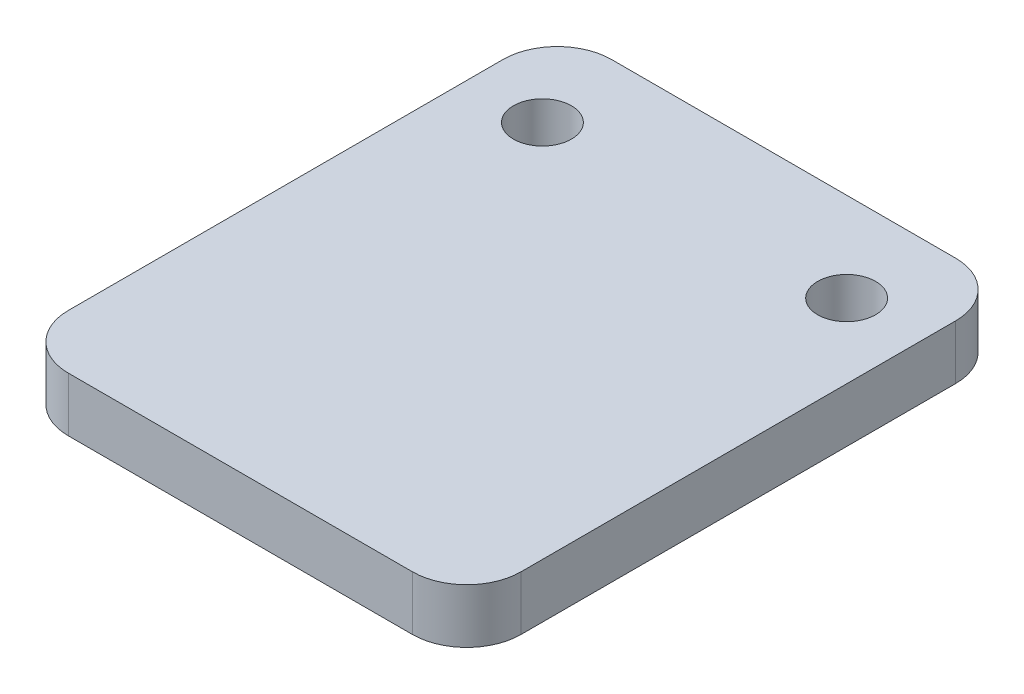
ISO-10303-21;
HEADER;
FILE_DESCRIPTION(('STEP AP214'),'2;1');
FILE_NAME('part.step','',(''),(''),'','','');
FILE_SCHEMA(('AUTOMOTIVE_DESIGN { 1 0 10303 214 1 1 1 1 }'));
ENDSEC;
DATA;
#1=APPLICATION_CONTEXT('core data for automotive mechanical design processes');
#2=APPLICATION_PROTOCOL_DEFINITION('international standard','automotive_design',2000,#1);
#3=PRODUCT_CONTEXT('',#1,'mechanical');
#4=PRODUCT('Part','Part','',(#3));
#5=PRODUCT_RELATED_PRODUCT_CATEGORY('part','',(#4));
#6=PRODUCT_DEFINITION_FORMATION('','',#4);
#7=PRODUCT_DEFINITION_CONTEXT('part definition',#1,'design');
#8=PRODUCT_DEFINITION('design','',#6,#7);
#9=PRODUCT_DEFINITION_SHAPE('','',#8);
#10=(LENGTH_UNIT() NAMED_UNIT(*) SI_UNIT(.MILLI.,.METRE.));
#11=(NAMED_UNIT(*) PLANE_ANGLE_UNIT() SI_UNIT($,.RADIAN.));
#12=(NAMED_UNIT(*) SI_UNIT($,.STERADIAN.) SOLID_ANGLE_UNIT());
#13=UNCERTAINTY_MEASURE_WITH_UNIT(LENGTH_MEASURE(1.E-05),#10,'distance_accuracy_value','');
#14=(GEOMETRIC_REPRESENTATION_CONTEXT(3) GLOBAL_UNCERTAINTY_ASSIGNED_CONTEXT((#13)) GLOBAL_UNIT_ASSIGNED_CONTEXT((#10,
#11,#12)) REPRESENTATION_CONTEXT('',''));
#15=CARTESIAN_POINT('',(0.,0.,0.));
#16=DIRECTION('',(0.,0.,1.));
#17=DIRECTION('',(1.,0.,0.));
#18=AXIS2_PLACEMENT_3D('',#15,#16,#17);
#19=CARTESIAN_POINT('',(0.,1.5,0.));
#20=DIRECTION('',(0.,1.,0.));
#21=DIRECTION('',(0.,0.,1.));
#22=AXIS2_PLACEMENT_3D('',#19,#20,#21);
#23=PLANE('',#22);
#24=CARTESIAN_POINT('',(-8.4,1.5,-10.08));
#25=DIRECTION('',(0.,1.,0.));
#26=DIRECTION('',(0.,0.,1.));
#27=AXIS2_PLACEMENT_3D('',#24,#25,#26);
#28=CIRCLE('',#27,1.6);
#29=CARTESIAN_POINT('',(-8.4,1.5,-8.48));
#30=VERTEX_POINT('',#29);
#31=EDGE_CURVE('E145',#30,#30,#28,.T.);
#32=ORIENTED_EDGE('',*,*,#31,.F.);
#33=EDGE_LOOP('',(#32));
#34=FACE_BOUND('',#33,.T.);
#35=DIRECTION('',(-1.,0.,0.));
#36=VECTOR('',#35,1.);
#37=CARTESIAN_POINT('',(12.5,1.5,-15.));
#38=LINE('',#37,#36);
#39=CARTESIAN_POINT('',(9.5,1.5,-15.));
#40=VERTEX_POINT('',#39);
#41=CARTESIAN_POINT('',(-9.50000000000001,1.5,-15.));
#42=VERTEX_POINT('',#41);
#43=EDGE_CURVE('E156',#40,#42,#38,.T.);
#44=ORIENTED_EDGE('',*,*,#43,.T.);
#45=CARTESIAN_POINT('',(-9.50000000000001,1.5,-12.));
#46=DIRECTION('',(0.,1.,0.));
#47=DIRECTION('',(0.,0.,1.));
#48=AXIS2_PLACEMENT_3D('',#45,#46,#47);
#49=CIRCLE('',#48,3.);
#50=CARTESIAN_POINT('',(-12.5,1.5,-12.));
#51=VERTEX_POINT('',#50);
#52=EDGE_CURVE('E185',#42,#51,#49,.T.);
#53=ORIENTED_EDGE('',*,*,#52,.T.);
#54=DIRECTION('',(0.,0.,1.));
#55=VECTOR('',#54,1.);
#56=CARTESIAN_POINT('',(-12.5,1.5,15.));
#57=LINE('',#56,#55);
#58=CARTESIAN_POINT('',(-12.5,1.5,12.));
#59=VERTEX_POINT('',#58);
#60=EDGE_CURVE('E134',#51,#59,#57,.T.);
#61=ORIENTED_EDGE('',*,*,#60,.T.);
#62=CARTESIAN_POINT('',(-9.50000000000001,1.5,12.));
#63=DIRECTION('',(0.,1.,0.));
#64=DIRECTION('',(0.,0.,1.));
#65=AXIS2_PLACEMENT_3D('',#62,#63,#64);
#66=CIRCLE('',#65,3.);
#67=CARTESIAN_POINT('',(-9.50000000000001,1.5,15.));
#68=VERTEX_POINT('',#67);
#69=EDGE_CURVE('E179',#59,#68,#66,.T.);
#70=ORIENTED_EDGE('',*,*,#69,.T.);
#71=DIRECTION('',(1.,0.,0.));
#72=VECTOR('',#71,1.);
#73=CARTESIAN_POINT('',(12.5,1.5,15.));
#74=LINE('',#73,#72);
#75=CARTESIAN_POINT('',(9.5,1.5,15.));
#76=VERTEX_POINT('',#75);
#77=EDGE_CURVE('E198',#68,#76,#74,.T.);
#78=ORIENTED_EDGE('',*,*,#77,.T.);
#79=CARTESIAN_POINT('',(9.5,1.5,12.));
#80=DIRECTION('',(0.,1.,0.));
#81=DIRECTION('',(0.,0.,1.));
#82=AXIS2_PLACEMENT_3D('',#79,#80,#81);
#83=CIRCLE('',#82,3.);
#84=CARTESIAN_POINT('',(12.5,1.5,12.));
#85=VERTEX_POINT('',#84);
#86=EDGE_CURVE('E68',#76,#85,#83,.T.);
#87=ORIENTED_EDGE('',*,*,#86,.T.);
#88=DIRECTION('',(0.,0.,-1.));
#89=VECTOR('',#88,1.);
#90=CARTESIAN_POINT('',(12.5,1.5,15.));
#91=LINE('',#90,#89);
#92=CARTESIAN_POINT('',(12.5,1.5,-12.));
#93=VERTEX_POINT('',#92);
#94=EDGE_CURVE('E205',#85,#93,#91,.T.);
#95=ORIENTED_EDGE('',*,*,#94,.T.);
#96=CARTESIAN_POINT('',(9.5,1.5,-12.));
#97=DIRECTION('',(0.,1.,0.));
#98=DIRECTION('',(0.,0.,1.));
#99=AXIS2_PLACEMENT_3D('',#96,#97,#98);
#100=CIRCLE('',#99,3.);
#101=EDGE_CURVE('E182',#93,#40,#100,.T.);
#102=ORIENTED_EDGE('',*,*,#101,.T.);
#103=EDGE_LOOP('',(#44,#53,#61,#70,#78,#87,#95,#102));
#104=FACE_BOUND('',#103,.T.);
#105=CARTESIAN_POINT('',(8.4,1.5,-10.08));
#106=DIRECTION('',(0.,1.,0.));
#107=DIRECTION('',(0.,0.,-1.));
#108=AXIS2_PLACEMENT_3D('',#105,#106,#107);
#109=CIRCLE('',#108,1.6);
#110=CARTESIAN_POINT('',(8.4,1.5,-11.68));
#111=VERTEX_POINT('',#110);
#112=EDGE_CURVE('E224',#111,#111,#109,.T.);
#113=ORIENTED_EDGE('',*,*,#112,.F.);
#114=EDGE_LOOP('',(#113));
#115=FACE_BOUND('',#114,.T.);
#116=ADVANCED_FACE('F45',(#34,#104,#115),#23,.T.);
#117=CARTESIAN_POINT('',(0.,-1.5,0.));
#118=DIRECTION('',(0.,1.,0.));
#119=DIRECTION('',(0.,0.,1.));
#120=AXIS2_PLACEMENT_3D('',#117,#118,#119);
#121=PLANE('',#120);
#122=DIRECTION('',(0.,0.,1.));
#123=VECTOR('',#122,1.);
#124=CARTESIAN_POINT('',(-12.5,-1.5,15.));
#125=LINE('',#124,#123);
#126=CARTESIAN_POINT('',(-12.5,-1.5,-12.));
#127=VERTEX_POINT('',#126);
#128=CARTESIAN_POINT('',(-12.5,-1.5,12.));
#129=VERTEX_POINT('',#128);
#130=EDGE_CURVE('E131',#127,#129,#125,.T.);
#131=ORIENTED_EDGE('',*,*,#130,.F.);
#132=CARTESIAN_POINT('',(-9.50000000000001,-1.5,-12.));
#133=DIRECTION('',(0.,1.,0.));
#134=DIRECTION('',(0.,0.,1.));
#135=AXIS2_PLACEMENT_3D('',#132,#133,#134);
#136=CIRCLE('',#135,3.);
#137=CARTESIAN_POINT('',(-9.50000000000001,-1.5,-15.));
#138=VERTEX_POINT('',#137);
#139=EDGE_CURVE('E113',#127,#138,#136,.F.);
#140=ORIENTED_EDGE('',*,*,#139,.T.);
#141=DIRECTION('',(-1.,0.,0.));
#142=VECTOR('',#141,1.);
#143=CARTESIAN_POINT('',(12.5,-1.5,-15.));
#144=LINE('',#143,#142);
#145=CARTESIAN_POINT('',(9.5,-1.5,-15.));
#146=VERTEX_POINT('',#145);
#147=EDGE_CURVE('E161',#146,#138,#144,.T.);
#148=ORIENTED_EDGE('',*,*,#147,.F.);
#149=CARTESIAN_POINT('',(9.5,-1.5,-12.));
#150=DIRECTION('',(0.,1.,0.));
#151=DIRECTION('',(0.,0.,1.));
#152=AXIS2_PLACEMENT_3D('',#149,#150,#151);
#153=CIRCLE('',#152,3.);
#154=CARTESIAN_POINT('',(12.5,-1.5,-12.));
#155=VERTEX_POINT('',#154);
#156=EDGE_CURVE('E125',#146,#155,#153,.F.);
#157=ORIENTED_EDGE('',*,*,#156,.T.);
#158=DIRECTION('',(0.,0.,-1.));
#159=VECTOR('',#158,1.);
#160=CARTESIAN_POINT('',(12.5,-1.5,15.));
#161=LINE('',#160,#159);
#162=CARTESIAN_POINT('',(12.5,-1.5,12.));
#163=VERTEX_POINT('',#162);
#164=EDGE_CURVE('E150',#163,#155,#161,.T.);
#165=ORIENTED_EDGE('',*,*,#164,.F.);
#166=CARTESIAN_POINT('',(9.5,-1.5,12.));
#167=DIRECTION('',(0.,1.,0.));
#168=DIRECTION('',(0.,0.,1.));
#169=AXIS2_PLACEMENT_3D('',#166,#167,#168);
#170=CIRCLE('',#169,3.);
#171=CARTESIAN_POINT('',(9.5,-1.5,15.));
#172=VERTEX_POINT('',#171);
#173=EDGE_CURVE('E136',#163,#172,#170,.F.);
#174=ORIENTED_EDGE('',*,*,#173,.T.);
#175=DIRECTION('',(1.,0.,0.));
#176=VECTOR('',#175,1.);
#177=CARTESIAN_POINT('',(12.5,-1.5,15.));
#178=LINE('',#177,#176);
#179=CARTESIAN_POINT('',(-9.50000000000001,-1.5,15.));
#180=VERTEX_POINT('',#179);
#181=EDGE_CURVE('E144',#180,#172,#178,.T.);
#182=ORIENTED_EDGE('',*,*,#181,.F.);
#183=CARTESIAN_POINT('',(-9.50000000000001,-1.5,12.));
#184=DIRECTION('',(0.,1.,0.));
#185=DIRECTION('',(0.,0.,1.));
#186=AXIS2_PLACEMENT_3D('',#183,#184,#185);
#187=CIRCLE('',#186,3.);
#188=EDGE_CURVE('E142',#180,#129,#187,.F.);
#189=ORIENTED_EDGE('',*,*,#188,.T.);
#190=EDGE_LOOP('',(#131,#140,#148,#157,#165,#174,#182,#189));
#191=FACE_BOUND('',#190,.T.);
#192=CARTESIAN_POINT('',(-8.4,-1.5,-10.08));
#193=DIRECTION('',(0.,1.,0.));
#194=DIRECTION('',(0.,0.,1.));
#195=AXIS2_PLACEMENT_3D('',#192,#193,#194);
#196=CIRCLE('',#195,1.6);
#197=CARTESIAN_POINT('',(-8.4,-1.5,-8.48));
#198=VERTEX_POINT('',#197);
#199=EDGE_CURVE('E153',#198,#198,#196,.T.);
#200=ORIENTED_EDGE('',*,*,#199,.T.);
#201=EDGE_LOOP('',(#200));
#202=FACE_BOUND('',#201,.T.);
#203=CARTESIAN_POINT('',(8.4,-1.5,-10.08));
#204=DIRECTION('',(0.,1.,0.));
#205=DIRECTION('',(0.,0.,-1.));
#206=AXIS2_PLACEMENT_3D('',#203,#204,#205);
#207=CIRCLE('',#206,1.6);
#208=CARTESIAN_POINT('',(8.4,-1.5,-11.68));
#209=VERTEX_POINT('',#208);
#210=EDGE_CURVE('E226',#209,#209,#207,.T.);
#211=ORIENTED_EDGE('',*,*,#210,.T.);
#212=EDGE_LOOP('',(#211));
#213=FACE_BOUND('',#212,.T.);
#214=ADVANCED_FACE('F139',(#191,#202,#213),#121,.F.);
#215=CARTESIAN_POINT('',(-12.5,1.5,15.));
#216=DIRECTION('',(1.,0.,0.));
#217=DIRECTION('',(0.,0.,-1.));
#218=AXIS2_PLACEMENT_3D('',#215,#216,#217);
#219=PLANE('',#218);
#220=ORIENTED_EDGE('',*,*,#60,.F.);
#221=DIRECTION('',(0.,-1.,0.));
#222=VECTOR('',#221,1.);
#223=CARTESIAN_POINT('',(-12.5,1.5,-12.));
#224=LINE('',#223,#222);
#225=EDGE_CURVE('E117',#51,#127,#224,.T.);
#226=ORIENTED_EDGE('',*,*,#225,.T.);
#227=ORIENTED_EDGE('',*,*,#130,.T.);
#228=DIRECTION('',(0.,-1.,0.));
#229=VECTOR('',#228,1.);
#230=CARTESIAN_POINT('',(-12.5,1.5,12.));
#231=LINE('',#230,#229);
#232=EDGE_CURVE('E137',#129,#59,#231,.F.);
#233=ORIENTED_EDGE('',*,*,#232,.T.);
#234=EDGE_LOOP('',(#220,#226,#227,#233));
#235=FACE_BOUND('',#234,.T.);
#236=ADVANCED_FACE('F130',(#235),#219,.F.);
#237=CARTESIAN_POINT('',(12.5,1.5,15.));
#238=DIRECTION('',(0.,0.,-1.));
#239=DIRECTION('',(-1.,0.,0.));
#240=AXIS2_PLACEMENT_3D('',#237,#238,#239);
#241=PLANE('',#240);
#242=ORIENTED_EDGE('',*,*,#77,.F.);
#243=DIRECTION('',(0.,-1.,0.));
#244=VECTOR('',#243,1.);
#245=CARTESIAN_POINT('',(-9.50000000000001,1.5,15.));
#246=LINE('',#245,#244);
#247=EDGE_CURVE('E11',#68,#180,#246,.T.);
#248=ORIENTED_EDGE('',*,*,#247,.T.);
#249=ORIENTED_EDGE('',*,*,#181,.T.);
#250=DIRECTION('',(0.,-1.,0.));
#251=VECTOR('',#250,1.);
#252=CARTESIAN_POINT('',(9.5,1.5,15.));
#253=LINE('',#252,#251);
#254=EDGE_CURVE('E54',#172,#76,#253,.F.);
#255=ORIENTED_EDGE('',*,*,#254,.T.);
#256=EDGE_LOOP('',(#242,#248,#249,#255));
#257=FACE_BOUND('',#256,.T.);
#258=ADVANCED_FACE('F197',(#257),#241,.F.);
#259=CARTESIAN_POINT('',(12.5,1.5,15.));
#260=DIRECTION('',(-1.,0.,0.));
#261=DIRECTION('',(0.,0.,1.));
#262=AXIS2_PLACEMENT_3D('',#259,#260,#261);
#263=PLANE('',#262);
#264=ORIENTED_EDGE('',*,*,#164,.T.);
#265=DIRECTION('',(0.,-1.,0.));
#266=VECTOR('',#265,1.);
#267=CARTESIAN_POINT('',(12.5,1.5,-12.));
#268=LINE('',#267,#266);
#269=EDGE_CURVE('E61',#155,#93,#268,.F.);
#270=ORIENTED_EDGE('',*,*,#269,.T.);
#271=ORIENTED_EDGE('',*,*,#94,.F.);
#272=DIRECTION('',(0.,-1.,0.));
#273=VECTOR('',#272,1.);
#274=CARTESIAN_POINT('',(12.5,1.5,12.));
#275=LINE('',#274,#273);
#276=EDGE_CURVE('E188',#85,#163,#275,.T.);
#277=ORIENTED_EDGE('',*,*,#276,.T.);
#278=EDGE_LOOP('',(#264,#270,#271,#277));
#279=FACE_BOUND('',#278,.T.);
#280=ADVANCED_FACE('F209',(#279),#263,.F.);
#281=CARTESIAN_POINT('',(12.5,1.5,-15.));
#282=DIRECTION('',(0.,0.,1.));
#283=DIRECTION('',(1.,0.,0.));
#284=AXIS2_PLACEMENT_3D('',#281,#282,#283);
#285=PLANE('',#284);
#286=ORIENTED_EDGE('',*,*,#147,.T.);
#287=DIRECTION('',(0.,-1.,0.));
#288=VECTOR('',#287,1.);
#289=CARTESIAN_POINT('',(-9.50000000000001,1.5,-15.));
#290=LINE('',#289,#288);
#291=EDGE_CURVE('E118',#138,#42,#290,.F.);
#292=ORIENTED_EDGE('',*,*,#291,.T.);
#293=ORIENTED_EDGE('',*,*,#43,.F.);
#294=DIRECTION('',(0.,-1.,0.));
#295=VECTOR('',#294,1.);
#296=CARTESIAN_POINT('',(9.5,1.5,-15.));
#297=LINE('',#296,#295);
#298=EDGE_CURVE('E124',#40,#146,#297,.T.);
#299=ORIENTED_EDGE('',*,*,#298,.T.);
#300=EDGE_LOOP('',(#286,#292,#293,#299));
#301=FACE_BOUND('',#300,.T.);
#302=ADVANCED_FACE('F216',(#301),#285,.F.);
#303=CARTESIAN_POINT('',(-8.4,1.5,-10.08));
#304=DIRECTION('',(0.,-1.,0.));
#305=DIRECTION('',(0.,0.,-1.));
#306=AXIS2_PLACEMENT_3D('',#303,#304,#305);
#307=CYLINDRICAL_SURFACE('',#306,1.6);
#308=ORIENTED_EDGE('',*,*,#31,.T.);
#309=EDGE_LOOP('',(#308));
#310=FACE_BOUND('',#309,.T.);
#311=ORIENTED_EDGE('',*,*,#199,.F.);
#312=EDGE_LOOP('',(#311));
#313=FACE_BOUND('',#312,.T.);
#314=ADVANCED_FACE('F246',(#310,#313),#307,.F.);
#315=CARTESIAN_POINT('',(8.4,1.5,-10.08));
#316=DIRECTION('',(0.,-1.,0.));
#317=DIRECTION('',(0.,0.,-1.));
#318=AXIS2_PLACEMENT_3D('',#315,#316,#317);
#319=CYLINDRICAL_SURFACE('',#318,1.6);
#320=ORIENTED_EDGE('',*,*,#112,.T.);
#321=EDGE_LOOP('',(#320));
#322=FACE_BOUND('',#321,.T.);
#323=ORIENTED_EDGE('',*,*,#210,.F.);
#324=EDGE_LOOP('',(#323));
#325=FACE_BOUND('',#324,.T.);
#326=ADVANCED_FACE('F234',(#322,#325),#319,.F.);
#327=CARTESIAN_POINT('',(-9.50000000000001,1.5,-12.));
#328=DIRECTION('',(0.,-1.,0.));
#329=DIRECTION('',(0.,0.,-1.));
#330=AXIS2_PLACEMENT_3D('',#327,#328,#329);
#331=CYLINDRICAL_SURFACE('',#330,3.);
#332=ORIENTED_EDGE('',*,*,#52,.F.);
#333=ORIENTED_EDGE('',*,*,#291,.F.);
#334=ORIENTED_EDGE('',*,*,#139,.F.);
#335=ORIENTED_EDGE('',*,*,#225,.F.);
#336=EDGE_LOOP('',(#332,#333,#334,#335));
#337=FACE_BOUND('',#336,.T.);
#338=ADVANCED_FACE('F116',(#337),#331,.T.);
#339=CARTESIAN_POINT('',(9.5,1.5,-12.));
#340=DIRECTION('',(0.,-1.,0.));
#341=DIRECTION('',(0.,0.,-1.));
#342=AXIS2_PLACEMENT_3D('',#339,#340,#341);
#343=CYLINDRICAL_SURFACE('',#342,3.);
#344=ORIENTED_EDGE('',*,*,#101,.F.);
#345=ORIENTED_EDGE('',*,*,#269,.F.);
#346=ORIENTED_EDGE('',*,*,#156,.F.);
#347=ORIENTED_EDGE('',*,*,#298,.F.);
#348=EDGE_LOOP('',(#344,#345,#346,#347));
#349=FACE_BOUND('',#348,.T.);
#350=ADVANCED_FACE('F213',(#349),#343,.T.);
#351=CARTESIAN_POINT('',(-9.50000000000001,1.5,12.));
#352=DIRECTION('',(0.,-1.,0.));
#353=DIRECTION('',(0.,0.,-1.));
#354=AXIS2_PLACEMENT_3D('',#351,#352,#353);
#355=CYLINDRICAL_SURFACE('',#354,3.);
#356=ORIENTED_EDGE('',*,*,#69,.F.);
#357=ORIENTED_EDGE('',*,*,#232,.F.);
#358=ORIENTED_EDGE('',*,*,#188,.F.);
#359=ORIENTED_EDGE('',*,*,#247,.F.);
#360=EDGE_LOOP('',(#356,#357,#358,#359));
#361=FACE_BOUND('',#360,.T.);
#362=ADVANCED_FACE('F260',(#361),#355,.T.);
#363=CARTESIAN_POINT('',(9.5,1.5,12.));
#364=DIRECTION('',(0.,-1.,0.));
#365=DIRECTION('',(0.,0.,-1.));
#366=AXIS2_PLACEMENT_3D('',#363,#364,#365);
#367=CYLINDRICAL_SURFACE('',#366,3.);
#368=ORIENTED_EDGE('',*,*,#86,.F.);
#369=ORIENTED_EDGE('',*,*,#254,.F.);
#370=ORIENTED_EDGE('',*,*,#173,.F.);
#371=ORIENTED_EDGE('',*,*,#276,.F.);
#372=EDGE_LOOP('',(#368,#369,#370,#371));
#373=FACE_BOUND('',#372,.T.);
#374=ADVANCED_FACE('F47',(#373),#367,.T.);
#375=CLOSED_SHELL('',(#116,#214,#236,#258,#280,#302,#314,#326,#338,#350,#362,#374));
#376=MANIFOLD_SOLID_BREP('B2',#375);
#377=ADVANCED_BREP_SHAPE_REPRESENTATION('',(#18,#376),#14);
#378=SHAPE_DEFINITION_REPRESENTATION(#9,#377);
ENDSEC;
END-ISO-10303-21;
